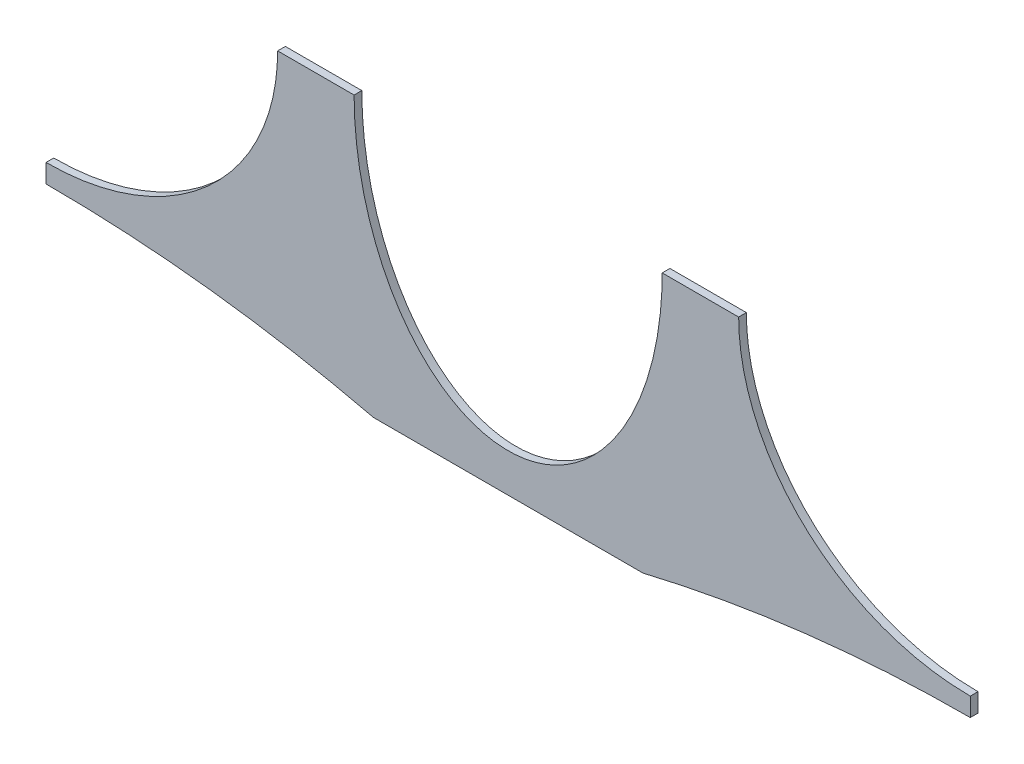
ISO-10303-21;
HEADER;
FILE_DESCRIPTION(('STEP AP214'),'2;1');
FILE_NAME('part.step','',(''),(''),'','','');
FILE_SCHEMA(('AUTOMOTIVE_DESIGN { 1 0 10303 214 1 1 1 1 }'));
ENDSEC;
DATA;
#1=APPLICATION_CONTEXT('core data for automotive mechanical design processes');
#2=APPLICATION_PROTOCOL_DEFINITION('international standard','automotive_design',2000,#1);
#3=PRODUCT_CONTEXT('',#1,'mechanical');
#4=PRODUCT('Part','Part','',(#3));
#5=PRODUCT_RELATED_PRODUCT_CATEGORY('part','',(#4));
#6=PRODUCT_DEFINITION_FORMATION('','',#4);
#7=PRODUCT_DEFINITION_CONTEXT('part definition',#1,'design');
#8=PRODUCT_DEFINITION('design','',#6,#7);
#9=PRODUCT_DEFINITION_SHAPE('','',#8);
#10=(LENGTH_UNIT() NAMED_UNIT(*) SI_UNIT(.MILLI.,.METRE.));
#11=(NAMED_UNIT(*) PLANE_ANGLE_UNIT() SI_UNIT($,.RADIAN.));
#12=(NAMED_UNIT(*) SI_UNIT($,.STERADIAN.) SOLID_ANGLE_UNIT());
#13=UNCERTAINTY_MEASURE_WITH_UNIT(LENGTH_MEASURE(1.E-05),#10,'distance_accuracy_value','');
#14=(GEOMETRIC_REPRESENTATION_CONTEXT(3) GLOBAL_UNCERTAINTY_ASSIGNED_CONTEXT((#13)) GLOBAL_UNIT_ASSIGNED_CONTEXT((#10,
#11,#12)) REPRESENTATION_CONTEXT('',''));
#15=CARTESIAN_POINT('',(0.,0.,0.));
#16=DIRECTION('',(0.,0.,1.));
#17=DIRECTION('',(1.,0.,0.));
#18=AXIS2_PLACEMENT_3D('',#15,#16,#17);
#19=CARTESIAN_POINT('',(-152.4,6.13688343545726,2.54));
#20=DIRECTION('',(1.,0.,0.));
#21=DIRECTION('',(0.,1.,0.));
#22=AXIS2_PLACEMENT_3D('',#19,#20,#21);
#23=PLANE('',#22);
#24=DIRECTION('',(0.,-1.,0.));
#25=VECTOR('',#24,1.);
#26=CARTESIAN_POINT('',(-152.4,6.13688343545726,0.));
#27=LINE('',#26,#25);
#28=CARTESIAN_POINT('',(-152.4,6.13688343545729,0.));
#29=VERTEX_POINT('',#28);
#30=CARTESIAN_POINT('',(-152.4,0.,0.));
#31=VERTEX_POINT('',#30);
#32=EDGE_CURVE('E141',#29,#31,#27,.T.);
#33=ORIENTED_EDGE('',*,*,#32,.T.);
#34=DIRECTION('',(0.,0.,-1.));
#35=VECTOR('',#34,1.);
#36=CARTESIAN_POINT('',(-152.4,0.,2.54));
#37=LINE('',#36,#35);
#38=CARTESIAN_POINT('',(-152.4,0.,2.54));
#39=VERTEX_POINT('',#38);
#40=EDGE_CURVE('E11',#39,#31,#37,.T.);
#41=ORIENTED_EDGE('',*,*,#40,.F.);
#42=DIRECTION('',(0.,-1.,0.));
#43=VECTOR('',#42,1.);
#44=CARTESIAN_POINT('',(-152.4,6.13688343545726,2.54));
#45=LINE('',#44,#43);
#46=CARTESIAN_POINT('',(-152.4,6.13688343545729,2.54));
#47=VERTEX_POINT('',#46);
#48=EDGE_CURVE('E92',#47,#39,#45,.T.);
#49=ORIENTED_EDGE('',*,*,#48,.F.);
#50=DIRECTION('',(0.,0.,-1.));
#51=VECTOR('',#50,1.);
#52=CARTESIAN_POINT('',(-152.4,6.13688343545729,2.54));
#53=LINE('',#52,#51);
#54=EDGE_CURVE('E49',#47,#29,#53,.T.);
#55=ORIENTED_EDGE('',*,*,#54,.T.);
#56=EDGE_LOOP('',(#33,#41,#49,#55));
#57=FACE_BOUND('',#56,.T.);
#58=ADVANCED_FACE('F33',(#57),#23,.F.);
#59=CARTESIAN_POINT('',(-152.4,-465.137500000002,2.54));
#60=DIRECTION('',(0.,0.,-1.));
#61=DIRECTION('',(-1.,0.,0.));
#62=AXIS2_PLACEMENT_3D('',#59,#60,#61);
#63=CYLINDRICAL_SURFACE('',#62,465.137500000002);
#64=CARTESIAN_POINT('',(-152.4,-465.137500000002,0.));
#65=DIRECTION('',(0.,0.,1.));
#66=DIRECTION('',(1.,0.,0.));
#67=AXIS2_PLACEMENT_3D('',#64,#65,#66);
#68=CIRCLE('',#67,465.137500000002);
#69=CARTESIAN_POINT('',(-44.45,-12.7,0.));
#70=VERTEX_POINT('',#69);
#71=EDGE_CURVE('E199',#70,#31,#68,.T.);
#72=ORIENTED_EDGE('',*,*,#71,.F.);
#73=DIRECTION('',(0.,0.,-1.));
#74=VECTOR('',#73,1.);
#75=CARTESIAN_POINT('',(-44.45,-12.7,2.54));
#76=LINE('',#75,#74);
#77=CARTESIAN_POINT('',(-44.45,-12.7,2.54));
#78=VERTEX_POINT('',#77);
#79=EDGE_CURVE('E41',#78,#70,#76,.T.);
#80=ORIENTED_EDGE('',*,*,#79,.F.);
#81=CARTESIAN_POINT('',(-152.4,-465.137500000002,2.54));
#82=DIRECTION('',(0.,0.,1.));
#83=DIRECTION('',(1.,0.,0.));
#84=AXIS2_PLACEMENT_3D('',#81,#82,#83);
#85=CIRCLE('',#84,465.137500000002);
#86=EDGE_CURVE('E218',#78,#39,#85,.T.);
#87=ORIENTED_EDGE('',*,*,#86,.T.);
#88=ORIENTED_EDGE('',*,*,#40,.T.);
#89=EDGE_LOOP('',(#72,#80,#87,#88));
#90=FACE_BOUND('',#89,.T.);
#91=ADVANCED_FACE('F204',(#90),#63,.F.);
#92=CARTESIAN_POINT('',(-44.45,-12.7,2.54));
#93=DIRECTION('',(0.,1.,0.));
#94=DIRECTION('',(0.,0.,1.));
#95=AXIS2_PLACEMENT_3D('',#92,#93,#94);
#96=PLANE('',#95);
#97=DIRECTION('',(1.,0.,0.));
#98=VECTOR('',#97,1.);
#99=CARTESIAN_POINT('',(-44.45,-12.7,0.));
#100=LINE('',#99,#98);
#101=CARTESIAN_POINT('',(44.4499999999999,-12.7,0.));
#102=VERTEX_POINT('',#101);
#103=EDGE_CURVE('E191',#70,#102,#100,.T.);
#104=ORIENTED_EDGE('',*,*,#103,.T.);
#105=DIRECTION('',(0.,0.,-1.));
#106=VECTOR('',#105,1.);
#107=CARTESIAN_POINT('',(44.4499999999999,-12.7,2.54));
#108=LINE('',#107,#106);
#109=CARTESIAN_POINT('',(44.4499999999999,-12.7,2.54));
#110=VERTEX_POINT('',#109);
#111=EDGE_CURVE('E184',#110,#102,#108,.T.);
#112=ORIENTED_EDGE('',*,*,#111,.F.);
#113=DIRECTION('',(1.,0.,0.));
#114=VECTOR('',#113,1.);
#115=CARTESIAN_POINT('',(-44.45,-12.7,2.54));
#116=LINE('',#115,#114);
#117=EDGE_CURVE('E193',#78,#110,#116,.T.);
#118=ORIENTED_EDGE('',*,*,#117,.F.);
#119=ORIENTED_EDGE('',*,*,#79,.T.);
#120=EDGE_LOOP('',(#104,#112,#118,#119));
#121=FACE_BOUND('',#120,.T.);
#122=ADVANCED_FACE('F189',(#121),#96,.F.);
#123=CARTESIAN_POINT('',(152.4,-465.137499999998,2.54));
#124=DIRECTION('',(0.,0.,-1.));
#125=DIRECTION('',(-1.,0.,0.));
#126=AXIS2_PLACEMENT_3D('',#123,#124,#125);
#127=CYLINDRICAL_SURFACE('',#126,465.137499999998);
#128=CARTESIAN_POINT('',(152.4,-465.137499999998,0.));
#129=DIRECTION('',(0.,0.,1.));
#130=DIRECTION('',(1.,0.,0.));
#131=AXIS2_PLACEMENT_3D('',#128,#129,#130);
#132=CIRCLE('',#131,465.137499999998);
#133=CARTESIAN_POINT('',(152.4,0.,0.));
#134=VERTEX_POINT('',#133);
#135=EDGE_CURVE('E202',#134,#102,#132,.T.);
#136=ORIENTED_EDGE('',*,*,#135,.F.);
#137=DIRECTION('',(0.,0.,-1.));
#138=VECTOR('',#137,1.);
#139=CARTESIAN_POINT('',(152.4,0.,2.54));
#140=LINE('',#139,#138);
#141=CARTESIAN_POINT('',(152.4,0.,2.54));
#142=VERTEX_POINT('',#141);
#143=EDGE_CURVE('E182',#142,#134,#140,.T.);
#144=ORIENTED_EDGE('',*,*,#143,.F.);
#145=CARTESIAN_POINT('',(152.4,-465.137499999998,2.54));
#146=DIRECTION('',(0.,0.,1.));
#147=DIRECTION('',(1.,0.,0.));
#148=AXIS2_PLACEMENT_3D('',#145,#146,#147);
#149=CIRCLE('',#148,465.137499999998);
#150=EDGE_CURVE('E222',#142,#110,#149,.T.);
#151=ORIENTED_EDGE('',*,*,#150,.T.);
#152=ORIENTED_EDGE('',*,*,#111,.T.);
#153=EDGE_LOOP('',(#136,#144,#151,#152));
#154=FACE_BOUND('',#153,.T.);
#155=ADVANCED_FACE('F231',(#154),#127,.F.);
#156=CARTESIAN_POINT('',(152.4,6.13688343545726,2.54));
#157=DIRECTION('',(1.,0.,0.));
#158=DIRECTION('',(0.,1.,0.));
#159=AXIS2_PLACEMENT_3D('',#156,#157,#158);
#160=PLANE('',#159);
#161=DIRECTION('',(0.,-1.,0.));
#162=VECTOR('',#161,1.);
#163=CARTESIAN_POINT('',(152.4,6.13688343545726,0.));
#164=LINE('',#163,#162);
#165=CARTESIAN_POINT('',(152.4,6.13688343545729,0.));
#166=VERTEX_POINT('',#165);
#167=EDGE_CURVE('E207',#166,#134,#164,.T.);
#168=ORIENTED_EDGE('',*,*,#167,.F.);
#169=DIRECTION('',(0.,0.,-1.));
#170=VECTOR('',#169,1.);
#171=CARTESIAN_POINT('',(152.4,6.13688343545729,2.54));
#172=LINE('',#171,#170);
#173=CARTESIAN_POINT('',(152.4,6.13688343545729,2.54));
#174=VERTEX_POINT('',#173);
#175=EDGE_CURVE('E177',#174,#166,#172,.T.);
#176=ORIENTED_EDGE('',*,*,#175,.F.);
#177=DIRECTION('',(0.,-1.,0.));
#178=VECTOR('',#177,1.);
#179=CARTESIAN_POINT('',(152.4,6.13688343545726,2.54));
#180=LINE('',#179,#178);
#181=EDGE_CURVE('E168',#174,#142,#180,.T.);
#182=ORIENTED_EDGE('',*,*,#181,.T.);
#183=ORIENTED_EDGE('',*,*,#143,.T.);
#184=EDGE_LOOP('',(#168,#176,#182,#183));
#185=FACE_BOUND('',#184,.T.);
#186=ADVANCED_FACE('F162',(#185),#160,.T.);
#187=CARTESIAN_POINT('',(152.4,76.2,2.54));
#188=DIRECTION('',(0.,0.,-1.));
#189=DIRECTION('',(1.,0.,0.));
#190=AXIS2_PLACEMENT_3D('',#187,#188,#189);
#191=ELLIPSE('',#190,76.3865757,70.0631165645427);
#192=DIRECTION('',(0.,0.,-1.));
#193=VECTOR('',#192,1.);
#194=SURFACE_OF_LINEAR_EXTRUSION('',#191,#193);
#195=CARTESIAN_POINT('',(152.4,76.2,0.));
#196=DIRECTION('',(0.,0.,-1.));
#197=DIRECTION('',(1.,0.,0.));
#198=AXIS2_PLACEMENT_3D('',#195,#196,#197);
#199=ELLIPSE('',#198,76.3865757,70.0631165645427);
#200=CARTESIAN_POINT('',(76.0134243,76.2,0.));
#201=VERTEX_POINT('',#200);
#202=EDGE_CURVE('E209',#166,#201,#199,.T.);
#203=ORIENTED_EDGE('',*,*,#202,.T.);
#204=DIRECTION('',(0.,0.,-1.));
#205=VECTOR('',#204,1.);
#206=CARTESIAN_POINT('',(76.0134243,76.2,2.54));
#207=LINE('',#206,#205);
#208=CARTESIAN_POINT('',(76.0134243,76.2,2.54));
#209=VERTEX_POINT('',#208);
#210=EDGE_CURVE('E172',#209,#201,#207,.T.);
#211=ORIENTED_EDGE('',*,*,#210,.F.);
#212=EDGE_CURVE('E165',#174,#209,#191,.T.);
#213=ORIENTED_EDGE('',*,*,#212,.F.);
#214=ORIENTED_EDGE('',*,*,#175,.T.);
#215=EDGE_LOOP('',(#203,#211,#213,#214));
#216=FACE_BOUND('',#215,.T.);
#217=ADVANCED_FACE('F157',(#216),#194,.F.);
#218=CARTESIAN_POINT('',(50.8,76.2,2.54));
#219=DIRECTION('',(0.,1.,0.));
#220=DIRECTION('',(0.,0.,1.));
#221=AXIS2_PLACEMENT_3D('',#218,#219,#220);
#222=PLANE('',#221);
#223=DIRECTION('',(1.,0.,0.));
#224=VECTOR('',#223,1.);
#225=CARTESIAN_POINT('',(50.8,76.2,0.));
#226=LINE('',#225,#224);
#227=CARTESIAN_POINT('',(50.8,76.2,0.));
#228=VERTEX_POINT('',#227);
#229=EDGE_CURVE('E175',#228,#201,#226,.T.);
#230=ORIENTED_EDGE('',*,*,#229,.F.);
#231=DIRECTION('',(0.,0.,-1.));
#232=VECTOR('',#231,1.);
#233=CARTESIAN_POINT('',(50.8,76.2,2.54));
#234=LINE('',#233,#232);
#235=CARTESIAN_POINT('',(50.8,76.2,2.54));
#236=VERTEX_POINT('',#235);
#237=EDGE_CURVE('E124',#236,#228,#234,.T.);
#238=ORIENTED_EDGE('',*,*,#237,.F.);
#239=DIRECTION('',(1.,0.,0.));
#240=VECTOR('',#239,1.);
#241=CARTESIAN_POINT('',(50.8,76.2,2.54));
#242=LINE('',#241,#240);
#243=EDGE_CURVE('E131',#236,#209,#242,.T.);
#244=ORIENTED_EDGE('',*,*,#243,.T.);
#245=ORIENTED_EDGE('',*,*,#210,.T.);
#246=EDGE_LOOP('',(#230,#238,#244,#245));
#247=FACE_BOUND('',#246,.T.);
#248=ADVANCED_FACE('F154',(#247),#222,.T.);
#249=CARTESIAN_POINT('',(0.,76.2,2.54));
#250=DIRECTION('',(0.,0.,1.));
#251=DIRECTION('',(0.,-1.,0.));
#252=AXIS2_PLACEMENT_3D('',#249,#250,#251);
#253=ELLIPSE('',#252,76.2,50.8);
#254=DIRECTION('',(0.,0.,-1.));
#255=VECTOR('',#254,1.);
#256=SURFACE_OF_LINEAR_EXTRUSION('',#253,#255);
#257=CARTESIAN_POINT('',(0.,76.2,0.));
#258=DIRECTION('',(0.,0.,1.));
#259=DIRECTION('',(0.,-1.,0.));
#260=AXIS2_PLACEMENT_3D('',#257,#258,#259);
#261=ELLIPSE('',#260,76.2,50.8);
#262=CARTESIAN_POINT('',(-50.8,76.2,0.));
#263=VERTEX_POINT('',#262);
#264=EDGE_CURVE('E120',#263,#228,#261,.T.);
#265=ORIENTED_EDGE('',*,*,#264,.F.);
#266=DIRECTION('',(0.,0.,-1.));
#267=VECTOR('',#266,1.);
#268=CARTESIAN_POINT('',(-50.8,76.2,2.54));
#269=LINE('',#268,#267);
#270=CARTESIAN_POINT('',(-50.8,76.2,2.54));
#271=VERTEX_POINT('',#270);
#272=EDGE_CURVE('E115',#271,#263,#269,.T.);
#273=ORIENTED_EDGE('',*,*,#272,.F.);
#274=EDGE_CURVE('E118',#271,#236,#253,.T.);
#275=ORIENTED_EDGE('',*,*,#274,.T.);
#276=ORIENTED_EDGE('',*,*,#237,.T.);
#277=EDGE_LOOP('',(#265,#273,#275,#276));
#278=FACE_BOUND('',#277,.T.);
#279=ADVANCED_FACE('F117',(#278),#256,.T.);
#280=CARTESIAN_POINT('',(-76.0134243,76.2,2.54));
#281=DIRECTION('',(0.,1.,0.));
#282=DIRECTION('',(0.,0.,1.));
#283=AXIS2_PLACEMENT_3D('',#280,#281,#282);
#284=PLANE('',#283);
#285=DIRECTION('',(1.,0.,0.));
#286=VECTOR('',#285,1.);
#287=CARTESIAN_POINT('',(-76.0134243,76.2,0.));
#288=LINE('',#287,#286);
#289=CARTESIAN_POINT('',(-76.0134243,76.2,0.));
#290=VERTEX_POINT('',#289);
#291=EDGE_CURVE('E213',#290,#263,#288,.T.);
#292=ORIENTED_EDGE('',*,*,#291,.F.);
#293=DIRECTION('',(0.,0.,-1.));
#294=VECTOR('',#293,1.);
#295=CARTESIAN_POINT('',(-76.0134243,76.2,2.54));
#296=LINE('',#295,#294);
#297=CARTESIAN_POINT('',(-76.0134243,76.2,2.54));
#298=VERTEX_POINT('',#297);
#299=EDGE_CURVE('E80',#298,#290,#296,.T.);
#300=ORIENTED_EDGE('',*,*,#299,.F.);
#301=DIRECTION('',(1.,0.,0.));
#302=VECTOR('',#301,1.);
#303=CARTESIAN_POINT('',(-76.0134243,76.2,2.54));
#304=LINE('',#303,#302);
#305=EDGE_CURVE('E129',#298,#271,#304,.T.);
#306=ORIENTED_EDGE('',*,*,#305,.T.);
#307=ORIENTED_EDGE('',*,*,#272,.T.);
#308=EDGE_LOOP('',(#292,#300,#306,#307));
#309=FACE_BOUND('',#308,.T.);
#310=ADVANCED_FACE('F133',(#309),#284,.T.);
#311=CARTESIAN_POINT('',(-152.4,76.2,2.54));
#312=DIRECTION('',(0.,0.,1.));
#313=DIRECTION('',(1.,0.,0.));
#314=AXIS2_PLACEMENT_3D('',#311,#312,#313);
#315=ELLIPSE('',#314,76.3865757,70.0631165645427);
#316=DIRECTION('',(0.,0.,-1.));
#317=VECTOR('',#316,1.);
#318=SURFACE_OF_LINEAR_EXTRUSION('',#315,#317);
#319=CARTESIAN_POINT('',(-152.4,76.2,0.));
#320=DIRECTION('',(0.,0.,1.));
#321=DIRECTION('',(1.,0.,0.));
#322=AXIS2_PLACEMENT_3D('',#319,#320,#321);
#323=ELLIPSE('',#322,76.3865757,70.0631165645427);
#324=EDGE_CURVE('E215',#29,#290,#323,.T.);
#325=ORIENTED_EDGE('',*,*,#324,.F.);
#326=ORIENTED_EDGE('',*,*,#54,.F.);
#327=EDGE_CURVE('E134',#47,#298,#315,.T.);
#328=ORIENTED_EDGE('',*,*,#327,.T.);
#329=ORIENTED_EDGE('',*,*,#299,.T.);
#330=EDGE_LOOP('',(#325,#326,#328,#329));
#331=FACE_BOUND('',#330,.T.);
#332=ADVANCED_FACE('F144',(#331),#318,.T.);
#333=CARTESIAN_POINT('',(152.4,76.2,2.54));
#334=DIRECTION('',(0.,0.,-1.));
#335=DIRECTION('',(-1.,0.,0.));
#336=AXIS2_PLACEMENT_3D('',#333,#334,#335);
#337=PLANE('',#336);
#338=ORIENTED_EDGE('',*,*,#48,.T.);
#339=ORIENTED_EDGE('',*,*,#86,.F.);
#340=ORIENTED_EDGE('',*,*,#117,.T.);
#341=ORIENTED_EDGE('',*,*,#150,.F.);
#342=ORIENTED_EDGE('',*,*,#181,.F.);
#343=ORIENTED_EDGE('',*,*,#212,.T.);
#344=ORIENTED_EDGE('',*,*,#243,.F.);
#345=ORIENTED_EDGE('',*,*,#274,.F.);
#346=ORIENTED_EDGE('',*,*,#305,.F.);
#347=ORIENTED_EDGE('',*,*,#327,.F.);
#348=EDGE_LOOP('',(#338,#339,#340,#341,#342,#343,#344,#345,#346,#347));
#349=FACE_BOUND('',#348,.T.);
#350=ADVANCED_FACE('F128',(#349),#337,.F.);
#351=CARTESIAN_POINT('',(152.4,76.2,0.));
#352=DIRECTION('',(0.,0.,-1.));
#353=DIRECTION('',(-1.,0.,0.));
#354=AXIS2_PLACEMENT_3D('',#351,#352,#353);
#355=PLANE('',#354);
#356=ORIENTED_EDGE('',*,*,#32,.F.);
#357=ORIENTED_EDGE('',*,*,#324,.T.);
#358=ORIENTED_EDGE('',*,*,#291,.T.);
#359=ORIENTED_EDGE('',*,*,#264,.T.);
#360=ORIENTED_EDGE('',*,*,#229,.T.);
#361=ORIENTED_EDGE('',*,*,#202,.F.);
#362=ORIENTED_EDGE('',*,*,#167,.T.);
#363=ORIENTED_EDGE('',*,*,#135,.T.);
#364=ORIENTED_EDGE('',*,*,#103,.F.);
#365=ORIENTED_EDGE('',*,*,#71,.T.);
#366=EDGE_LOOP('',(#356,#357,#358,#359,#360,#361,#362,#363,#364,#365));
#367=FACE_BOUND('',#366,.T.);
#368=ADVANCED_FACE('F148',(#367),#355,.T.);
#369=CLOSED_SHELL('',(#58,#91,#122,#155,#186,#217,#248,#279,#310,#332,#350,#368));
#370=MANIFOLD_SOLID_BREP('B2',#369);
#371=ADVANCED_BREP_SHAPE_REPRESENTATION('',(#18,#370),#14);
#372=SHAPE_DEFINITION_REPRESENTATION(#9,#371);
ENDSEC;
END-ISO-10303-21;
